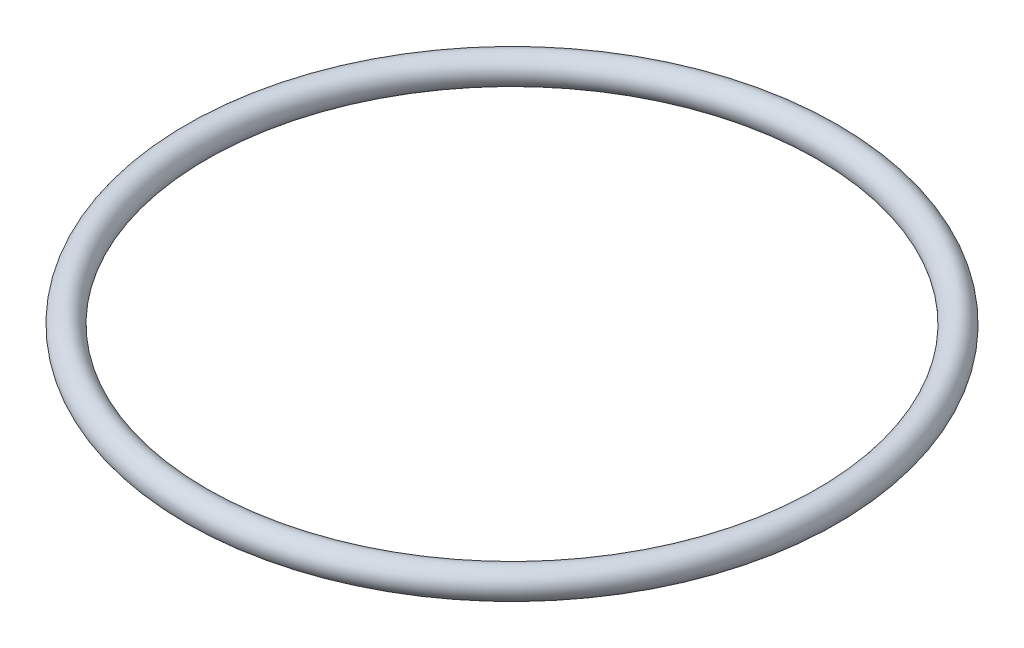
ISO-10303-21;
HEADER;
FILE_DESCRIPTION(('STEP AP214'),'2;1');
FILE_NAME('part.step','',(''),(''),'','','');
FILE_SCHEMA(('AUTOMOTIVE_DESIGN { 1 0 10303 214 1 1 1 1 }'));
ENDSEC;
DATA;
#1=APPLICATION_CONTEXT('core data for automotive mechanical design processes');
#2=APPLICATION_PROTOCOL_DEFINITION('international standard','automotive_design',2000,#1);
#3=PRODUCT_CONTEXT('',#1,'mechanical');
#4=PRODUCT('Part','Part','',(#3));
#5=PRODUCT_RELATED_PRODUCT_CATEGORY('part','',(#4));
#6=PRODUCT_DEFINITION_FORMATION('','',#4);
#7=PRODUCT_DEFINITION_CONTEXT('part definition',#1,'design');
#8=PRODUCT_DEFINITION('design','',#6,#7);
#9=PRODUCT_DEFINITION_SHAPE('','',#8);
#10=(LENGTH_UNIT() NAMED_UNIT(*) SI_UNIT(.MILLI.,.METRE.));
#11=(NAMED_UNIT(*) PLANE_ANGLE_UNIT() SI_UNIT($,.RADIAN.));
#12=(NAMED_UNIT(*) SI_UNIT($,.STERADIAN.) SOLID_ANGLE_UNIT());
#13=UNCERTAINTY_MEASURE_WITH_UNIT(LENGTH_MEASURE(1.E-05),#10,'distance_accuracy_value','');
#14=(GEOMETRIC_REPRESENTATION_CONTEXT(3) GLOBAL_UNCERTAINTY_ASSIGNED_CONTEXT((#13)) GLOBAL_UNIT_ASSIGNED_CONTEXT((#10,
#11,#12)) REPRESENTATION_CONTEXT('',''));
#15=CARTESIAN_POINT('',(0.,0.,0.));
#16=DIRECTION('',(0.,0.,1.));
#17=DIRECTION('',(1.,0.,0.));
#18=AXIS2_PLACEMENT_3D('',#15,#16,#17);
#19=CARTESIAN_POINT('',(0.,0.,0.));
#20=DIRECTION('',(0.,1.,0.));
#21=DIRECTION('',(0.,0.,1.));
#22=AXIS2_PLACEMENT_3D('',#19,#20,#21);
#23=TOROIDAL_SURFACE('',#22,19.8,0.89);
#24=CARTESIAN_POINT('',(0.,0.,-19.8));
#25=DIRECTION('',(-1.,0.,0.));
#26=DIRECTION('',(0.,0.,-1.));
#27=AXIS2_PLACEMENT_3D('',#24,#25,#26);
#28=CIRCLE('',#27,0.89);
#29=CARTESIAN_POINT('',(0.,0.,-18.91));
#30=VERTEX_POINT('',#29);
#31=EDGE_CURVE('E19',#30,#30,#28,.T.);
#32=ORIENTED_EDGE('',*,*,#31,.F.);
#33=CARTESIAN_POINT('',(0.,0.,0.));
#34=DIRECTION('',(0.,-1.,0.));
#35=DIRECTION('',(0.,0.,1.));
#36=AXIS2_PLACEMENT_3D('',#33,#34,#35);
#37=CIRCLE('',#36,18.91);
#38=EDGE_CURVE('E11',#30,#30,#37,.T.);
#39=ORIENTED_EDGE('',*,*,#38,.T.);
#40=ORIENTED_EDGE('',*,*,#31,.T.);
#41=ORIENTED_EDGE('',*,*,#38,.F.);
#42=EDGE_LOOP('',(#32,#39,#40,#41));
#43=FACE_BOUND('',#42,.T.);
#44=ADVANCED_FACE('F17',(#43),#23,.T.);
#45=CLOSED_SHELL('',(#44));
#46=MANIFOLD_SOLID_BREP('B1',#45);
#47=ADVANCED_BREP_SHAPE_REPRESENTATION('',(#18,#46),#14);
#48=SHAPE_DEFINITION_REPRESENTATION(#9,#47);
ENDSEC;
END-ISO-10303-21;
